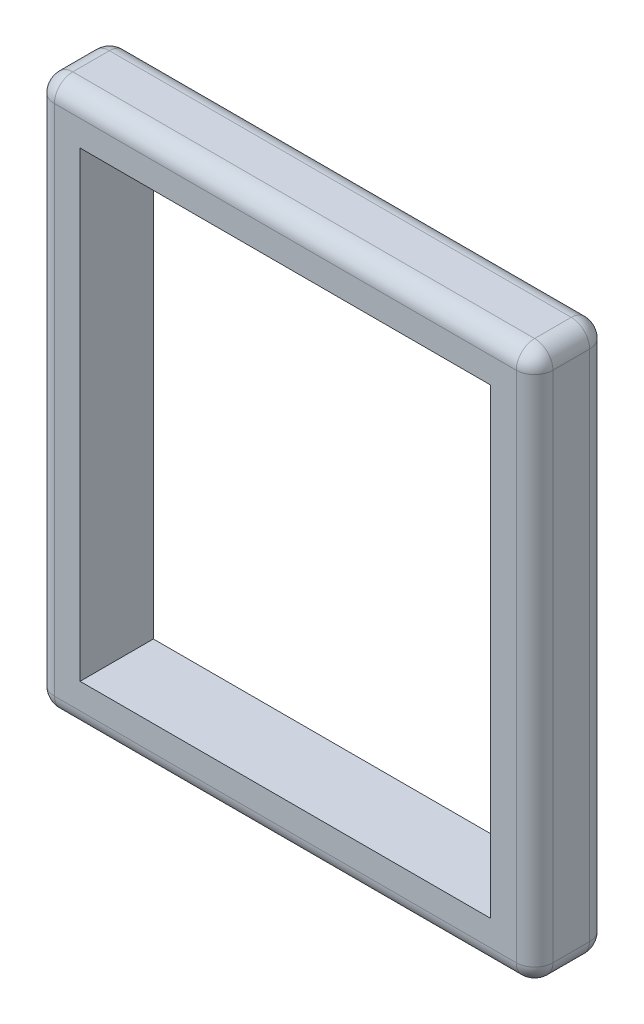
ISO-10303-21;
HEADER;
FILE_DESCRIPTION(('STEP AP214'),'2;1');
FILE_NAME('part.step','',(''),(''),'','','');
FILE_SCHEMA(('AUTOMOTIVE_DESIGN { 1 0 10303 214 1 1 1 1 }'));
ENDSEC;
DATA;
#1=APPLICATION_CONTEXT('core data for automotive mechanical design processes');
#2=APPLICATION_PROTOCOL_DEFINITION('international standard','automotive_design',2000,#1);
#3=PRODUCT_CONTEXT('',#1,'mechanical');
#4=PRODUCT('Part','Part','',(#3));
#5=PRODUCT_RELATED_PRODUCT_CATEGORY('part','',(#4));
#6=PRODUCT_DEFINITION_FORMATION('','',#4);
#7=PRODUCT_DEFINITION_CONTEXT('part definition',#1,'design');
#8=PRODUCT_DEFINITION('design','',#6,#7);
#9=PRODUCT_DEFINITION_SHAPE('','',#8);
#10=(LENGTH_UNIT() NAMED_UNIT(*) SI_UNIT(.MILLI.,.METRE.));
#11=(NAMED_UNIT(*) PLANE_ANGLE_UNIT() SI_UNIT($,.RADIAN.));
#12=(NAMED_UNIT(*) SI_UNIT($,.STERADIAN.) SOLID_ANGLE_UNIT());
#13=UNCERTAINTY_MEASURE_WITH_UNIT(LENGTH_MEASURE(1.E-05),#10,'distance_accuracy_value','');
#14=(GEOMETRIC_REPRESENTATION_CONTEXT(3) GLOBAL_UNCERTAINTY_ASSIGNED_CONTEXT((#13)) GLOBAL_UNIT_ASSIGNED_CONTEXT((#10,
#11,#12)) REPRESENTATION_CONTEXT('',''));
#15=CARTESIAN_POINT('',(0.,0.,0.));
#16=DIRECTION('',(0.,0.,1.));
#17=DIRECTION('',(1.,0.,0.));
#18=AXIS2_PLACEMENT_3D('',#15,#16,#17);
#19=CARTESIAN_POINT('',(0.,0.,12.7));
#20=DIRECTION('',(0.,0.,1.));
#21=DIRECTION('',(1.,0.,0.));
#22=AXIS2_PLACEMENT_3D('',#19,#20,#21);
#23=PLANE('',#22);
#24=DIRECTION('',(-1.,0.,0.));
#25=VECTOR('',#24,1.);
#26=CARTESIAN_POINT('',(-86.36,92.075,12.7));
#27=LINE('',#26,#25);
#28=CARTESIAN_POINT('',(-3.175,92.075,12.7));
#29=VERTEX_POINT('',#28);
#30=CARTESIAN_POINT('',(-83.185,92.075,12.7));
#31=VERTEX_POINT('',#30);
#32=EDGE_CURVE('E212',#29,#31,#27,.T.);
#33=ORIENTED_EDGE('',*,*,#32,.T.);
#34=DIRECTION('',(0.,-1.,0.));
#35=VECTOR('',#34,1.);
#36=CARTESIAN_POINT('',(-83.185,0.,12.7));
#37=LINE('',#36,#35);
#38=CARTESIAN_POINT('',(-83.185,3.17499999999999,12.7));
#39=VERTEX_POINT('',#38);
#40=EDGE_CURVE('E215',#31,#39,#37,.T.);
#41=ORIENTED_EDGE('',*,*,#40,.T.);
#42=DIRECTION('',(1.,0.,0.));
#43=VECTOR('',#42,1.);
#44=CARTESIAN_POINT('',(0.,3.175,12.7));
#45=LINE('',#44,#43);
#46=CARTESIAN_POINT('',(-3.175,3.175,12.7));
#47=VERTEX_POINT('',#46);
#48=EDGE_CURVE('E174',#39,#47,#45,.T.);
#49=ORIENTED_EDGE('',*,*,#48,.T.);
#50=DIRECTION('',(0.,1.,0.));
#51=VECTOR('',#50,1.);
#52=CARTESIAN_POINT('',(-3.175,95.25,12.7));
#53=LINE('',#52,#51);
#54=EDGE_CURVE('E209',#47,#29,#53,.T.);
#55=ORIENTED_EDGE('',*,*,#54,.T.);
#56=EDGE_LOOP('',(#33,#41,#49,#55));
#57=FACE_BOUND('',#56,.T.);
#58=DIRECTION('',(1.,0.,0.));
#59=VECTOR('',#58,1.);
#60=CARTESIAN_POINT('',(-78.74,7.61999999999999,12.7));
#61=LINE('',#60,#59);
#62=CARTESIAN_POINT('',(-78.74,7.61999999999999,12.7));
#63=VERTEX_POINT('',#62);
#64=CARTESIAN_POINT('',(-7.62,7.61999999999999,12.7));
#65=VERTEX_POINT('',#64);
#66=EDGE_CURVE('E165',#63,#65,#61,.T.);
#67=ORIENTED_EDGE('',*,*,#66,.F.);
#68=DIRECTION('',(0.,-1.,0.));
#69=VECTOR('',#68,1.);
#70=CARTESIAN_POINT('',(-78.74,87.63,12.7));
#71=LINE('',#70,#69);
#72=CARTESIAN_POINT('',(-78.74,87.63,12.7));
#73=VERTEX_POINT('',#72);
#74=EDGE_CURVE('E154',#73,#63,#71,.T.);
#75=ORIENTED_EDGE('',*,*,#74,.F.);
#76=DIRECTION('',(-1.,0.,0.));
#77=VECTOR('',#76,1.);
#78=CARTESIAN_POINT('',(-78.74,87.63,12.7));
#79=LINE('',#78,#77);
#80=CARTESIAN_POINT('',(-7.62000000000001,87.63,12.7));
#81=VERTEX_POINT('',#80);
#82=EDGE_CURVE('E183',#81,#73,#79,.T.);
#83=ORIENTED_EDGE('',*,*,#82,.F.);
#84=DIRECTION('',(0.,1.,0.));
#85=VECTOR('',#84,1.);
#86=CARTESIAN_POINT('',(-7.62000000000001,87.63,12.7));
#87=LINE('',#86,#85);
#88=EDGE_CURVE('E179',#65,#81,#87,.T.);
#89=ORIENTED_EDGE('',*,*,#88,.F.);
#90=EDGE_LOOP('',(#67,#75,#83,#89));
#91=FACE_BOUND('',#90,.T.);
#92=ADVANCED_FACE('F39',(#57,#91),#23,.T.);
#93=CARTESIAN_POINT('',(0.,0.,0.));
#94=DIRECTION('',(0.,0.,1.));
#95=DIRECTION('',(1.,0.,0.));
#96=AXIS2_PLACEMENT_3D('',#93,#94,#95);
#97=PLANE('',#96);
#98=DIRECTION('',(1.,0.,0.));
#99=VECTOR('',#98,1.);
#100=CARTESIAN_POINT('',(0.,3.175,0.));
#101=LINE('',#100,#99);
#102=CARTESIAN_POINT('',(-3.175,3.175,0.));
#103=VERTEX_POINT('',#102);
#104=CARTESIAN_POINT('',(-83.185,3.17499999999999,0.));
#105=VERTEX_POINT('',#104);
#106=EDGE_CURVE('E232',#103,#105,#101,.F.);
#107=ORIENTED_EDGE('',*,*,#106,.T.);
#108=DIRECTION('',(0.,-1.,0.));
#109=VECTOR('',#108,1.);
#110=CARTESIAN_POINT('',(-83.185,0.,0.));
#111=LINE('',#110,#109);
#112=CARTESIAN_POINT('',(-83.185,92.075,0.));
#113=VERTEX_POINT('',#112);
#114=EDGE_CURVE('E241',#105,#113,#111,.F.);
#115=ORIENTED_EDGE('',*,*,#114,.T.);
#116=DIRECTION('',(-1.,0.,0.));
#117=VECTOR('',#116,1.);
#118=CARTESIAN_POINT('',(0.,92.075,0.));
#119=LINE('',#118,#117);
#120=CARTESIAN_POINT('',(-3.175,92.075,0.));
#121=VERTEX_POINT('',#120);
#122=EDGE_CURVE('E238',#113,#121,#119,.F.);
#123=ORIENTED_EDGE('',*,*,#122,.T.);
#124=DIRECTION('',(0.,1.,0.));
#125=VECTOR('',#124,1.);
#126=CARTESIAN_POINT('',(-3.175,0.,0.));
#127=LINE('',#126,#125);
#128=EDGE_CURVE('E235',#121,#103,#127,.F.);
#129=ORIENTED_EDGE('',*,*,#128,.T.);
#130=EDGE_LOOP('',(#107,#115,#123,#129));
#131=FACE_BOUND('',#130,.T.);
#132=DIRECTION('',(0.,-1.,0.));
#133=VECTOR('',#132,1.);
#134=CARTESIAN_POINT('',(-78.74,87.63,0.));
#135=LINE('',#134,#133);
#136=CARTESIAN_POINT('',(-78.74,87.63,0.));
#137=VERTEX_POINT('',#136);
#138=CARTESIAN_POINT('',(-78.74,7.61999999999999,0.));
#139=VERTEX_POINT('',#138);
#140=EDGE_CURVE('E188',#137,#139,#135,.T.);
#141=ORIENTED_EDGE('',*,*,#140,.T.);
#142=DIRECTION('',(1.,0.,0.));
#143=VECTOR('',#142,1.);
#144=CARTESIAN_POINT('',(-78.74,7.61999999999999,0.));
#145=LINE('',#144,#143);
#146=CARTESIAN_POINT('',(-7.62,7.61999999999999,0.));
#147=VERTEX_POINT('',#146);
#148=EDGE_CURVE('E172',#139,#147,#145,.T.);
#149=ORIENTED_EDGE('',*,*,#148,.T.);
#150=DIRECTION('',(0.,1.,0.));
#151=VECTOR('',#150,1.);
#152=CARTESIAN_POINT('',(-7.62000000000001,87.63,0.));
#153=LINE('',#152,#151);
#154=CARTESIAN_POINT('',(-7.62000000000001,87.63,0.));
#155=VERTEX_POINT('',#154);
#156=EDGE_CURVE('E193',#147,#155,#153,.T.);
#157=ORIENTED_EDGE('',*,*,#156,.T.);
#158=DIRECTION('',(-1.,0.,0.));
#159=VECTOR('',#158,1.);
#160=CARTESIAN_POINT('',(-78.74,87.63,0.));
#161=LINE('',#160,#159);
#162=EDGE_CURVE('E166',#155,#137,#161,.T.);
#163=ORIENTED_EDGE('',*,*,#162,.T.);
#164=EDGE_LOOP('',(#141,#149,#157,#163));
#165=FACE_BOUND('',#164,.T.);
#166=ADVANCED_FACE('F413',(#131,#165),#97,.F.);
#167=CARTESIAN_POINT('',(0.,0.,12.7));
#168=DIRECTION('',(-1.,0.,0.));
#169=DIRECTION('',(0.,-1.,0.));
#170=AXIS2_PLACEMENT_3D('',#167,#168,#169);
#171=PLANE('',#170);
#172=DIRECTION('',(0.,0.,-1.));
#173=VECTOR('',#172,1.);
#174=CARTESIAN_POINT('',(0.,92.075,12.7));
#175=LINE('',#174,#173);
#176=CARTESIAN_POINT('',(0.,92.075,3.175));
#177=VERTEX_POINT('',#176);
#178=CARTESIAN_POINT('',(0.,92.075,9.525));
#179=VERTEX_POINT('',#178);
#180=EDGE_CURVE('E264',#177,#179,#175,.F.);
#181=ORIENTED_EDGE('',*,*,#180,.T.);
#182=DIRECTION('',(0.,1.,0.));
#183=VECTOR('',#182,1.);
#184=CARTESIAN_POINT('',(0.,0.,9.525));
#185=LINE('',#184,#183);
#186=CARTESIAN_POINT('',(0.,3.175,9.525));
#187=VERTEX_POINT('',#186);
#188=EDGE_CURVE('E267',#179,#187,#185,.F.);
#189=ORIENTED_EDGE('',*,*,#188,.T.);
#190=DIRECTION('',(0.,0.,-1.));
#191=VECTOR('',#190,1.);
#192=CARTESIAN_POINT('',(0.,3.175,12.7));
#193=LINE('',#192,#191);
#194=CARTESIAN_POINT('',(0.,3.175,3.175));
#195=VERTEX_POINT('',#194);
#196=EDGE_CURVE('E258',#187,#195,#193,.T.);
#197=ORIENTED_EDGE('',*,*,#196,.T.);
#198=DIRECTION('',(0.,1.,0.));
#199=VECTOR('',#198,1.);
#200=CARTESIAN_POINT('',(0.,0.,3.175));
#201=LINE('',#200,#199);
#202=EDGE_CURVE('E261',#195,#177,#201,.T.);
#203=ORIENTED_EDGE('',*,*,#202,.T.);
#204=EDGE_LOOP('',(#181,#189,#197,#203));
#205=FACE_BOUND('',#204,.T.);
#206=ADVANCED_FACE('F393',(#205),#171,.F.);
#207=CARTESIAN_POINT('',(0.,95.25,12.7));
#208=DIRECTION('',(0.,-1.,0.));
#209=DIRECTION('',(0.,0.,-1.));
#210=AXIS2_PLACEMENT_3D('',#207,#208,#209);
#211=PLANE('',#210);
#212=DIRECTION('',(0.,0.,-1.));
#213=VECTOR('',#212,1.);
#214=CARTESIAN_POINT('',(-83.185,95.25,12.7));
#215=LINE('',#214,#213);
#216=CARTESIAN_POINT('',(-83.185,95.25,3.175));
#217=VERTEX_POINT('',#216);
#218=CARTESIAN_POINT('',(-83.185,95.25,9.525));
#219=VERTEX_POINT('',#218);
#220=EDGE_CURVE('E251',#217,#219,#215,.F.);
#221=ORIENTED_EDGE('',*,*,#220,.T.);
#222=DIRECTION('',(-1.,0.,0.));
#223=VECTOR('',#222,1.);
#224=CARTESIAN_POINT('',(0.,95.25,9.525));
#225=LINE('',#224,#223);
#226=CARTESIAN_POINT('',(-3.175,95.25,9.525));
#227=VERTEX_POINT('',#226);
#228=EDGE_CURVE('E254',#219,#227,#225,.F.);
#229=ORIENTED_EDGE('',*,*,#228,.T.);
#230=DIRECTION('',(0.,0.,-1.));
#231=VECTOR('',#230,1.);
#232=CARTESIAN_POINT('',(-3.175,95.25,12.7));
#233=LINE('',#232,#231);
#234=CARTESIAN_POINT('',(-3.175,95.25,3.175));
#235=VERTEX_POINT('',#234);
#236=EDGE_CURVE('E245',#227,#235,#233,.T.);
#237=ORIENTED_EDGE('',*,*,#236,.T.);
#238=DIRECTION('',(-1.,0.,0.));
#239=VECTOR('',#238,1.);
#240=CARTESIAN_POINT('',(0.,95.25,3.175));
#241=LINE('',#240,#239);
#242=EDGE_CURVE('E248',#235,#217,#241,.T.);
#243=ORIENTED_EDGE('',*,*,#242,.T.);
#244=EDGE_LOOP('',(#221,#229,#237,#243));
#245=FACE_BOUND('',#244,.T.);
#246=ADVANCED_FACE('F384',(#245),#211,.F.);
#247=CARTESIAN_POINT('',(-86.36,0.,12.7));
#248=DIRECTION('',(1.,0.,0.));
#249=DIRECTION('',(0.,0.,-1.));
#250=AXIS2_PLACEMENT_3D('',#247,#248,#249);
#251=PLANE('',#250);
#252=DIRECTION('',(0.,-1.,0.));
#253=VECTOR('',#252,1.);
#254=CARTESIAN_POINT('',(-86.36,95.25,9.525));
#255=LINE('',#254,#253);
#256=CARTESIAN_POINT('',(-86.36,3.17499999999999,9.525));
#257=VERTEX_POINT('',#256);
#258=CARTESIAN_POINT('',(-86.36,92.075,9.525));
#259=VERTEX_POINT('',#258);
#260=EDGE_CURVE('E225',#257,#259,#255,.F.);
#261=ORIENTED_EDGE('',*,*,#260,.T.);
#262=DIRECTION('',(0.,0.,-1.));
#263=VECTOR('',#262,1.);
#264=CARTESIAN_POINT('',(-86.36,92.075,12.7));
#265=LINE('',#264,#263);
#266=CARTESIAN_POINT('',(-86.36,92.075,3.175));
#267=VERTEX_POINT('',#266);
#268=EDGE_CURVE('E229',#259,#267,#265,.T.);
#269=ORIENTED_EDGE('',*,*,#268,.T.);
#270=DIRECTION('',(0.,-1.,0.));
#271=VECTOR('',#270,1.);
#272=CARTESIAN_POINT('',(-86.36,0.,3.175));
#273=LINE('',#272,#271);
#274=CARTESIAN_POINT('',(-86.36,3.17499999999999,3.175));
#275=VERTEX_POINT('',#274);
#276=EDGE_CURVE('E222',#267,#275,#273,.T.);
#277=ORIENTED_EDGE('',*,*,#276,.T.);
#278=DIRECTION('',(0.,0.,-1.));
#279=VECTOR('',#278,1.);
#280=CARTESIAN_POINT('',(-86.36,3.17499999999999,12.7));
#281=LINE('',#280,#279);
#282=EDGE_CURVE('E219',#275,#257,#281,.F.);
#283=ORIENTED_EDGE('',*,*,#282,.T.);
#284=EDGE_LOOP('',(#261,#269,#277,#283));
#285=FACE_BOUND('',#284,.T.);
#286=ADVANCED_FACE('F460',(#285),#251,.F.);
#287=CARTESIAN_POINT('',(0.,0.,12.7));
#288=DIRECTION('',(0.,1.,0.));
#289=DIRECTION('',(-1.,0.,0.));
#290=AXIS2_PLACEMENT_3D('',#287,#288,#289);
#291=PLANE('',#290);
#292=DIRECTION('',(1.,0.,0.));
#293=VECTOR('',#292,1.);
#294=CARTESIAN_POINT('',(-86.36,0.,9.525));
#295=LINE('',#294,#293);
#296=CARTESIAN_POINT('',(-3.175,0.,9.525));
#297=VERTEX_POINT('',#296);
#298=CARTESIAN_POINT('',(-83.185,0.,9.525));
#299=VERTEX_POINT('',#298);
#300=EDGE_CURVE('E49',#297,#299,#295,.F.);
#301=ORIENTED_EDGE('',*,*,#300,.T.);
#302=DIRECTION('',(0.,0.,-1.));
#303=VECTOR('',#302,1.);
#304=CARTESIAN_POINT('',(-83.185,0.,12.7));
#305=LINE('',#304,#303);
#306=CARTESIAN_POINT('',(-83.185,0.,3.175));
#307=VERTEX_POINT('',#306);
#308=EDGE_CURVE('E11',#299,#307,#305,.T.);
#309=ORIENTED_EDGE('',*,*,#308,.T.);
#310=DIRECTION('',(1.,0.,0.));
#311=VECTOR('',#310,1.);
#312=CARTESIAN_POINT('',(0.,0.,3.175));
#313=LINE('',#312,#311);
#314=CARTESIAN_POINT('',(-3.175,0.,3.175));
#315=VERTEX_POINT('',#314);
#316=EDGE_CURVE('E271',#307,#315,#313,.T.);
#317=ORIENTED_EDGE('',*,*,#316,.T.);
#318=DIRECTION('',(0.,0.,-1.));
#319=VECTOR('',#318,1.);
#320=CARTESIAN_POINT('',(-3.175,0.,12.7));
#321=LINE('',#320,#319);
#322=EDGE_CURVE('E60',#315,#297,#321,.F.);
#323=ORIENTED_EDGE('',*,*,#322,.T.);
#324=EDGE_LOOP('',(#301,#309,#317,#323));
#325=FACE_BOUND('',#324,.T.);
#326=ADVANCED_FACE('F457',(#325),#291,.F.);
#327=CARTESIAN_POINT('',(-78.74,87.63,12.7));
#328=DIRECTION('',(1.,0.,0.));
#329=DIRECTION('',(0.,0.,-1.));
#330=AXIS2_PLACEMENT_3D('',#327,#328,#329);
#331=PLANE('',#330);
#332=ORIENTED_EDGE('',*,*,#140,.F.);
#333=DIRECTION('',(0.,0.,-1.));
#334=VECTOR('',#333,1.);
#335=CARTESIAN_POINT('',(-78.74,87.63,12.7));
#336=LINE('',#335,#334);
#337=EDGE_CURVE('E160',#73,#137,#336,.T.);
#338=ORIENTED_EDGE('',*,*,#337,.F.);
#339=ORIENTED_EDGE('',*,*,#74,.T.);
#340=DIRECTION('',(0.,0.,-1.));
#341=VECTOR('',#340,1.);
#342=CARTESIAN_POINT('',(-78.74,7.61999999999999,12.7));
#343=LINE('',#342,#341);
#344=EDGE_CURVE('E157',#63,#139,#343,.T.);
#345=ORIENTED_EDGE('',*,*,#344,.T.);
#346=EDGE_LOOP('',(#332,#338,#339,#345));
#347=FACE_BOUND('',#346,.T.);
#348=ADVANCED_FACE('F156',(#347),#331,.T.);
#349=CARTESIAN_POINT('',(-78.74,7.61999999999999,12.7));
#350=DIRECTION('',(0.,1.,0.));
#351=DIRECTION('',(0.,0.,1.));
#352=AXIS2_PLACEMENT_3D('',#349,#350,#351);
#353=PLANE('',#352);
#354=ORIENTED_EDGE('',*,*,#148,.F.);
#355=ORIENTED_EDGE('',*,*,#344,.F.);
#356=ORIENTED_EDGE('',*,*,#66,.T.);
#357=DIRECTION('',(0.,0.,-1.));
#358=VECTOR('',#357,1.);
#359=CARTESIAN_POINT('',(-7.62,7.61999999999999,12.7));
#360=LINE('',#359,#358);
#361=EDGE_CURVE('E175',#65,#147,#360,.T.);
#362=ORIENTED_EDGE('',*,*,#361,.T.);
#363=EDGE_LOOP('',(#354,#355,#356,#362));
#364=FACE_BOUND('',#363,.T.);
#365=ADVANCED_FACE('F169',(#364),#353,.T.);
#366=CARTESIAN_POINT('',(-7.62000000000001,87.63,12.7));
#367=DIRECTION('',(-1.,0.,0.));
#368=DIRECTION('',(0.,-1.,0.));
#369=AXIS2_PLACEMENT_3D('',#366,#367,#368);
#370=PLANE('',#369);
#371=ORIENTED_EDGE('',*,*,#156,.F.);
#372=ORIENTED_EDGE('',*,*,#361,.F.);
#373=ORIENTED_EDGE('',*,*,#88,.T.);
#374=DIRECTION('',(0.,0.,-1.));
#375=VECTOR('',#374,1.);
#376=CARTESIAN_POINT('',(-7.62000000000001,87.63,12.7));
#377=LINE('',#376,#375);
#378=EDGE_CURVE('E202',#81,#155,#377,.T.);
#379=ORIENTED_EDGE('',*,*,#378,.T.);
#380=EDGE_LOOP('',(#371,#372,#373,#379));
#381=FACE_BOUND('',#380,.T.);
#382=ADVANCED_FACE('F630',(#381),#370,.T.);
#383=CARTESIAN_POINT('',(-78.74,87.63,12.7));
#384=DIRECTION('',(0.,-1.,0.));
#385=DIRECTION('',(0.,0.,-1.));
#386=AXIS2_PLACEMENT_3D('',#383,#384,#385);
#387=PLANE('',#386);
#388=ORIENTED_EDGE('',*,*,#162,.F.);
#389=ORIENTED_EDGE('',*,*,#378,.F.);
#390=ORIENTED_EDGE('',*,*,#82,.T.);
#391=ORIENTED_EDGE('',*,*,#337,.T.);
#392=EDGE_LOOP('',(#388,#389,#390,#391));
#393=FACE_BOUND('',#392,.T.);
#394=ADVANCED_FACE('F622',(#393),#387,.T.);
#395=CARTESIAN_POINT('',(-3.175,0.,3.175));
#396=DIRECTION('',(0.,1.,0.));
#397=DIRECTION('',(-1.,0.,0.));
#398=AXIS2_PLACEMENT_3D('',#395,#396,#397);
#399=CYLINDRICAL_SURFACE('',#398,3.175);
#400=CARTESIAN_POINT('',(-3.175,92.075,3.175));
#401=DIRECTION('',(0.,1.,0.));
#402=DIRECTION('',(0.,0.,1.));
#403=AXIS2_PLACEMENT_3D('',#400,#401,#402);
#404=CIRCLE('',#403,3.175);
#405=EDGE_CURVE('E43',#177,#121,#404,.T.);
#406=ORIENTED_EDGE('',*,*,#405,.F.);
#407=ORIENTED_EDGE('',*,*,#202,.F.);
#408=CARTESIAN_POINT('',(-3.175,3.175,3.175));
#409=DIRECTION('',(0.,-1.,0.));
#410=DIRECTION('',(0.,0.,-1.));
#411=AXIS2_PLACEMENT_3D('',#408,#409,#410);
#412=CIRCLE('',#411,3.175);
#413=EDGE_CURVE('E359',#103,#195,#412,.T.);
#414=ORIENTED_EDGE('',*,*,#413,.F.);
#415=ORIENTED_EDGE('',*,*,#128,.F.);
#416=EDGE_LOOP('',(#406,#407,#414,#415));
#417=FACE_BOUND('',#416,.T.);
#418=ADVANCED_FACE('F41',(#417),#399,.T.);
#419=CARTESIAN_POINT('',(-3.175,92.075,3.175));
#420=DIRECTION('',(0.,0.,1.));
#421=DIRECTION('',(1.,0.,0.));
#422=AXIS2_PLACEMENT_3D('',#419,#420,#421);
#423=SPHERICAL_SURFACE('',#422,3.175);
#424=CARTESIAN_POINT('',(-3.175,92.075,3.175));
#425=DIRECTION('',(0.,0.,-1.));
#426=DIRECTION('',(-1.,0.,0.));
#427=AXIS2_PLACEMENT_3D('',#424,#425,#426);
#428=CIRCLE('',#427,3.175);
#429=EDGE_CURVE('E352',#177,#235,#428,.F.);
#430=ORIENTED_EDGE('',*,*,#429,.F.);
#431=ORIENTED_EDGE('',*,*,#405,.T.);
#432=CARTESIAN_POINT('',(-3.175,92.075,3.175));
#433=DIRECTION('',(1.,0.,0.));
#434=DIRECTION('',(0.,0.,-1.));
#435=AXIS2_PLACEMENT_3D('',#432,#433,#434);
#436=CIRCLE('',#435,3.175);
#437=EDGE_CURVE('E356',#235,#121,#436,.F.);
#438=ORIENTED_EDGE('',*,*,#437,.F.);
#439=EDGE_LOOP('',(#430,#431,#438));
#440=FACE_BOUND('',#439,.T.);
#441=ADVANCED_FACE('F372',(#440),#423,.T.);
#442=CARTESIAN_POINT('',(-3.175,3.175,3.175));
#443=DIRECTION('',(0.,0.,1.));
#444=DIRECTION('',(1.,0.,0.));
#445=AXIS2_PLACEMENT_3D('',#442,#443,#444);
#446=SPHERICAL_SURFACE('',#445,3.175);
#447=CARTESIAN_POINT('',(-3.175,3.175,3.175));
#448=DIRECTION('',(1.,0.,0.));
#449=DIRECTION('',(0.,1.,0.));
#450=AXIS2_PLACEMENT_3D('',#447,#448,#449);
#451=CIRCLE('',#450,3.175);
#452=EDGE_CURVE('E344',#103,#315,#451,.F.);
#453=ORIENTED_EDGE('',*,*,#452,.F.);
#454=ORIENTED_EDGE('',*,*,#413,.T.);
#455=CARTESIAN_POINT('',(-3.175,3.175,3.175));
#456=DIRECTION('',(0.,0.,-1.));
#457=DIRECTION('',(-1.,0.,0.));
#458=AXIS2_PLACEMENT_3D('',#455,#456,#457);
#459=CIRCLE('',#458,3.175);
#460=EDGE_CURVE('E348',#315,#195,#459,.F.);
#461=ORIENTED_EDGE('',*,*,#460,.F.);
#462=EDGE_LOOP('',(#453,#454,#461));
#463=FACE_BOUND('',#462,.T.);
#464=ADVANCED_FACE('F406',(#463),#446,.T.);
#465=CARTESIAN_POINT('',(0.,92.075,3.175));
#466=DIRECTION('',(-1.,0.,0.));
#467=DIRECTION('',(0.,0.,1.));
#468=AXIS2_PLACEMENT_3D('',#465,#466,#467);
#469=CYLINDRICAL_SURFACE('',#468,3.175);
#470=ORIENTED_EDGE('',*,*,#437,.T.);
#471=ORIENTED_EDGE('',*,*,#122,.F.);
#472=CARTESIAN_POINT('',(-83.185,92.075,3.175));
#473=DIRECTION('',(-1.,0.,0.));
#474=DIRECTION('',(0.,0.,1.));
#475=AXIS2_PLACEMENT_3D('',#472,#473,#474);
#476=CIRCLE('',#475,3.175);
#477=EDGE_CURVE('E337',#217,#113,#476,.T.);
#478=ORIENTED_EDGE('',*,*,#477,.F.);
#479=ORIENTED_EDGE('',*,*,#242,.F.);
#480=EDGE_LOOP('',(#470,#471,#478,#479));
#481=FACE_BOUND('',#480,.T.);
#482=ADVANCED_FACE('F380',(#481),#469,.T.);
#483=CARTESIAN_POINT('',(-3.175,92.075,12.7));
#484=DIRECTION('',(0.,0.,-1.));
#485=DIRECTION('',(-1.,0.,0.));
#486=AXIS2_PLACEMENT_3D('',#483,#484,#485);
#487=CYLINDRICAL_SURFACE('',#486,3.175);
#488=ORIENTED_EDGE('',*,*,#429,.T.);
#489=ORIENTED_EDGE('',*,*,#236,.F.);
#490=CARTESIAN_POINT('',(-3.175,92.075,9.525));
#491=DIRECTION('',(0.,0.,1.));
#492=DIRECTION('',(1.,0.,0.));
#493=AXIS2_PLACEMENT_3D('',#490,#491,#492);
#494=CIRCLE('',#493,3.175);
#495=EDGE_CURVE('E333',#179,#227,#494,.T.);
#496=ORIENTED_EDGE('',*,*,#495,.F.);
#497=ORIENTED_EDGE('',*,*,#180,.F.);
#498=EDGE_LOOP('',(#488,#489,#496,#497));
#499=FACE_BOUND('',#498,.T.);
#500=ADVANCED_FACE('F390',(#499),#487,.T.);
#501=CARTESIAN_POINT('',(-3.175,0.,9.525));
#502=DIRECTION('',(0.,-1.,0.));
#503=DIRECTION('',(1.,0.,0.));
#504=AXIS2_PLACEMENT_3D('',#501,#502,#503);
#505=CYLINDRICAL_SURFACE('',#504,3.175);
#506=CARTESIAN_POINT('',(-3.175,3.175,9.525));
#507=DIRECTION('',(0.,-1.,0.));
#508=DIRECTION('',(0.,0.,-1.));
#509=AXIS2_PLACEMENT_3D('',#506,#507,#508);
#510=CIRCLE('',#509,3.175);
#511=EDGE_CURVE('E325',#187,#47,#510,.T.);
#512=ORIENTED_EDGE('',*,*,#511,.F.);
#513=ORIENTED_EDGE('',*,*,#188,.F.);
#514=CARTESIAN_POINT('',(-3.175,92.075,9.525));
#515=DIRECTION('',(0.,1.,0.));
#516=DIRECTION('',(0.,0.,1.));
#517=AXIS2_PLACEMENT_3D('',#514,#515,#516);
#518=CIRCLE('',#517,3.175);
#519=EDGE_CURVE('E329',#29,#179,#518,.T.);
#520=ORIENTED_EDGE('',*,*,#519,.F.);
#521=ORIENTED_EDGE('',*,*,#54,.F.);
#522=EDGE_LOOP('',(#512,#513,#520,#521));
#523=FACE_BOUND('',#522,.T.);
#524=ADVANCED_FACE('F397',(#523),#505,.T.);
#525=CARTESIAN_POINT('',(-3.175,3.175,12.7));
#526=DIRECTION('',(0.,0.,-1.));
#527=DIRECTION('',(-1.,0.,0.));
#528=AXIS2_PLACEMENT_3D('',#525,#526,#527);
#529=CYLINDRICAL_SURFACE('',#528,3.175);
#530=ORIENTED_EDGE('',*,*,#460,.T.);
#531=ORIENTED_EDGE('',*,*,#196,.F.);
#532=CARTESIAN_POINT('',(-3.175,3.175,9.525));
#533=DIRECTION('',(0.,0.,1.));
#534=DIRECTION('',(1.,0.,0.));
#535=AXIS2_PLACEMENT_3D('',#532,#533,#534);
#536=CIRCLE('',#535,3.175);
#537=EDGE_CURVE('E322',#297,#187,#536,.T.);
#538=ORIENTED_EDGE('',*,*,#537,.F.);
#539=ORIENTED_EDGE('',*,*,#322,.F.);
#540=EDGE_LOOP('',(#530,#531,#538,#539));
#541=FACE_BOUND('',#540,.T.);
#542=ADVANCED_FACE('F404',(#541),#529,.T.);
#543=CARTESIAN_POINT('',(0.,3.175,3.175));
#544=DIRECTION('',(1.,0.,0.));
#545=DIRECTION('',(0.,1.,0.));
#546=AXIS2_PLACEMENT_3D('',#543,#544,#545);
#547=CYLINDRICAL_SURFACE('',#546,3.175);
#548=ORIENTED_EDGE('',*,*,#452,.T.);
#549=ORIENTED_EDGE('',*,*,#316,.F.);
#550=CARTESIAN_POINT('',(-83.185,3.17499999999999,3.175));
#551=DIRECTION('',(-1.,0.,0.));
#552=DIRECTION('',(0.,0.,1.));
#553=AXIS2_PLACEMENT_3D('',#550,#551,#552);
#554=CIRCLE('',#553,3.175);
#555=EDGE_CURVE('E318',#105,#307,#554,.T.);
#556=ORIENTED_EDGE('',*,*,#555,.F.);
#557=ORIENTED_EDGE('',*,*,#106,.F.);
#558=EDGE_LOOP('',(#548,#549,#556,#557));
#559=FACE_BOUND('',#558,.T.);
#560=ADVANCED_FACE('F410',(#559),#547,.T.);
#561=CARTESIAN_POINT('',(-83.185,0.,3.175));
#562=DIRECTION('',(0.,-1.,0.));
#563=DIRECTION('',(0.,0.,-1.));
#564=AXIS2_PLACEMENT_3D('',#561,#562,#563);
#565=CYLINDRICAL_SURFACE('',#564,3.175);
#566=CARTESIAN_POINT('',(-83.185,92.075,3.175));
#567=DIRECTION('',(0.,1.,0.));
#568=DIRECTION('',(0.,0.,1.));
#569=AXIS2_PLACEMENT_3D('',#566,#567,#568);
#570=CIRCLE('',#569,3.175);
#571=EDGE_CURVE('E340',#113,#267,#570,.T.);
#572=ORIENTED_EDGE('',*,*,#571,.F.);
#573=ORIENTED_EDGE('',*,*,#114,.F.);
#574=CARTESIAN_POINT('',(-83.185,3.17499999999999,3.175));
#575=DIRECTION('',(0.,-1.,0.));
#576=DIRECTION('',(0.,0.,-1.));
#577=AXIS2_PLACEMENT_3D('',#574,#575,#576);
#578=CIRCLE('',#577,3.175);
#579=EDGE_CURVE('E314',#275,#105,#578,.T.);
#580=ORIENTED_EDGE('',*,*,#579,.F.);
#581=ORIENTED_EDGE('',*,*,#276,.F.);
#582=EDGE_LOOP('',(#572,#573,#580,#581));
#583=FACE_BOUND('',#582,.T.);
#584=ADVANCED_FACE('F418',(#583),#565,.T.);
#585=CARTESIAN_POINT('',(-83.185,92.075,3.175));
#586=DIRECTION('',(0.,0.,1.));
#587=DIRECTION('',(1.,0.,0.));
#588=AXIS2_PLACEMENT_3D('',#585,#586,#587);
#589=SPHERICAL_SURFACE('',#588,3.175);
#590=ORIENTED_EDGE('',*,*,#477,.T.);
#591=ORIENTED_EDGE('',*,*,#571,.T.);
#592=CARTESIAN_POINT('',(-83.185,92.075,3.175));
#593=DIRECTION('',(0.,0.,-1.));
#594=DIRECTION('',(-1.,0.,0.));
#595=AXIS2_PLACEMENT_3D('',#592,#593,#594);
#596=CIRCLE('',#595,3.175);
#597=EDGE_CURVE('E310',#217,#267,#596,.F.);
#598=ORIENTED_EDGE('',*,*,#597,.F.);
#599=EDGE_LOOP('',(#590,#591,#598));
#600=FACE_BOUND('',#599,.T.);
#601=ADVANCED_FACE('F422',(#600),#589,.T.);
#602=CARTESIAN_POINT('',(-3.175,92.075,9.525));
#603=DIRECTION('',(0.,0.,1.));
#604=DIRECTION('',(1.,0.,0.));
#605=AXIS2_PLACEMENT_3D('',#602,#603,#604);
#606=SPHERICAL_SURFACE('',#605,3.175);
#607=ORIENTED_EDGE('',*,*,#519,.T.);
#608=ORIENTED_EDGE('',*,*,#495,.T.);
#609=CARTESIAN_POINT('',(-3.175,92.075,9.525));
#610=DIRECTION('',(1.,0.,0.));
#611=DIRECTION('',(0.,0.,-1.));
#612=AXIS2_PLACEMENT_3D('',#609,#610,#611);
#613=CIRCLE('',#612,3.175);
#614=EDGE_CURVE('E307',#29,#227,#613,.F.);
#615=ORIENTED_EDGE('',*,*,#614,.F.);
#616=EDGE_LOOP('',(#607,#608,#615));
#617=FACE_BOUND('',#616,.T.);
#618=ADVANCED_FACE('F436',(#617),#606,.T.);
#619=CARTESIAN_POINT('',(-3.175,3.175,9.525));
#620=DIRECTION('',(0.,0.,1.));
#621=DIRECTION('',(1.,0.,0.));
#622=AXIS2_PLACEMENT_3D('',#619,#620,#621);
#623=SPHERICAL_SURFACE('',#622,3.175);
#624=ORIENTED_EDGE('',*,*,#537,.T.);
#625=ORIENTED_EDGE('',*,*,#511,.T.);
#626=CARTESIAN_POINT('',(-3.175,3.175,9.525));
#627=DIRECTION('',(1.,0.,0.));
#628=DIRECTION('',(0.,1.,0.));
#629=AXIS2_PLACEMENT_3D('',#626,#627,#628);
#630=CIRCLE('',#629,3.175);
#631=EDGE_CURVE('E303',#297,#47,#630,.F.);
#632=ORIENTED_EDGE('',*,*,#631,.F.);
#633=EDGE_LOOP('',(#624,#625,#632));
#634=FACE_BOUND('',#633,.T.);
#635=ADVANCED_FACE('F438',(#634),#623,.T.);
#636=CARTESIAN_POINT('',(-83.185,3.17499999999999,3.175));
#637=DIRECTION('',(0.,0.,1.));
#638=DIRECTION('',(1.,0.,0.));
#639=AXIS2_PLACEMENT_3D('',#636,#637,#638);
#640=SPHERICAL_SURFACE('',#639,3.175);
#641=ORIENTED_EDGE('',*,*,#579,.T.);
#642=ORIENTED_EDGE('',*,*,#555,.T.);
#643=CARTESIAN_POINT('',(-83.185,3.17499999999999,3.175));
#644=DIRECTION('',(0.,0.,-1.));
#645=DIRECTION('',(-1.,0.,0.));
#646=AXIS2_PLACEMENT_3D('',#643,#644,#645);
#647=CIRCLE('',#646,3.175);
#648=EDGE_CURVE('E300',#275,#307,#647,.F.);
#649=ORIENTED_EDGE('',*,*,#648,.F.);
#650=EDGE_LOOP('',(#641,#642,#649));
#651=FACE_BOUND('',#650,.T.);
#652=ADVANCED_FACE('F444',(#651),#640,.T.);
#653=CARTESIAN_POINT('',(-83.185,92.075,12.7));
#654=DIRECTION('',(0.,0.,-1.));
#655=DIRECTION('',(-1.,0.,0.));
#656=AXIS2_PLACEMENT_3D('',#653,#654,#655);
#657=CYLINDRICAL_SURFACE('',#656,3.175);
#658=ORIENTED_EDGE('',*,*,#597,.T.);
#659=ORIENTED_EDGE('',*,*,#268,.F.);
#660=CARTESIAN_POINT('',(-83.185,92.075,9.525));
#661=DIRECTION('',(0.,0.,1.));
#662=DIRECTION('',(1.,0.,0.));
#663=AXIS2_PLACEMENT_3D('',#660,#661,#662);
#664=CIRCLE('',#663,3.175);
#665=EDGE_CURVE('E296',#219,#259,#664,.T.);
#666=ORIENTED_EDGE('',*,*,#665,.F.);
#667=ORIENTED_EDGE('',*,*,#220,.F.);
#668=EDGE_LOOP('',(#658,#659,#666,#667));
#669=FACE_BOUND('',#668,.T.);
#670=ADVANCED_FACE('F425',(#669),#657,.T.);
#671=CARTESIAN_POINT('',(0.,92.075,9.525));
#672=DIRECTION('',(1.,0.,0.));
#673=DIRECTION('',(0.,0.,-1.));
#674=AXIS2_PLACEMENT_3D('',#671,#672,#673);
#675=CYLINDRICAL_SURFACE('',#674,3.175);
#676=ORIENTED_EDGE('',*,*,#614,.T.);
#677=ORIENTED_EDGE('',*,*,#228,.F.);
#678=CARTESIAN_POINT('',(-83.185,92.075,9.525));
#679=DIRECTION('',(-1.,0.,0.));
#680=DIRECTION('',(0.,0.,1.));
#681=AXIS2_PLACEMENT_3D('',#678,#679,#680);
#682=CIRCLE('',#681,3.175);
#683=EDGE_CURVE('E292',#31,#219,#682,.T.);
#684=ORIENTED_EDGE('',*,*,#683,.F.);
#685=ORIENTED_EDGE('',*,*,#32,.F.);
#686=EDGE_LOOP('',(#676,#677,#684,#685));
#687=FACE_BOUND('',#686,.T.);
#688=ADVANCED_FACE('F434',(#687),#675,.T.);
#689=CARTESIAN_POINT('',(0.,3.175,9.525));
#690=DIRECTION('',(-1.,0.,0.));
#691=DIRECTION('',(0.,-1.,0.));
#692=AXIS2_PLACEMENT_3D('',#689,#690,#691);
#693=CYLINDRICAL_SURFACE('',#692,3.175);
#694=ORIENTED_EDGE('',*,*,#631,.T.);
#695=ORIENTED_EDGE('',*,*,#48,.F.);
#696=CARTESIAN_POINT('',(-83.185,3.17499999999999,9.525));
#697=DIRECTION('',(-1.,0.,0.));
#698=DIRECTION('',(0.,0.,1.));
#699=AXIS2_PLACEMENT_3D('',#696,#697,#698);
#700=CIRCLE('',#699,3.175);
#701=EDGE_CURVE('E288',#299,#39,#700,.T.);
#702=ORIENTED_EDGE('',*,*,#701,.F.);
#703=ORIENTED_EDGE('',*,*,#300,.F.);
#704=EDGE_LOOP('',(#694,#695,#702,#703));
#705=FACE_BOUND('',#704,.T.);
#706=ADVANCED_FACE('F481',(#705),#693,.T.);
#707=CARTESIAN_POINT('',(-83.185,3.17499999999999,12.7));
#708=DIRECTION('',(0.,0.,-1.));
#709=DIRECTION('',(-1.,0.,0.));
#710=AXIS2_PLACEMENT_3D('',#707,#708,#709);
#711=CYLINDRICAL_SURFACE('',#710,3.175);
#712=ORIENTED_EDGE('',*,*,#648,.T.);
#713=ORIENTED_EDGE('',*,*,#308,.F.);
#714=CARTESIAN_POINT('',(-83.185,3.17499999999999,9.525));
#715=DIRECTION('',(0.,0.,1.));
#716=DIRECTION('',(1.,0.,0.));
#717=AXIS2_PLACEMENT_3D('',#714,#715,#716);
#718=CIRCLE('',#717,3.175);
#719=EDGE_CURVE('E284',#257,#299,#718,.T.);
#720=ORIENTED_EDGE('',*,*,#719,.F.);
#721=ORIENTED_EDGE('',*,*,#282,.F.);
#722=EDGE_LOOP('',(#712,#713,#720,#721));
#723=FACE_BOUND('',#722,.T.);
#724=ADVANCED_FACE('F478',(#723),#711,.T.);
#725=CARTESIAN_POINT('',(-83.185,92.075,9.525));
#726=DIRECTION('',(0.,0.,1.));
#727=DIRECTION('',(1.,0.,0.));
#728=AXIS2_PLACEMENT_3D('',#725,#726,#727);
#729=SPHERICAL_SURFACE('',#728,3.175);
#730=ORIENTED_EDGE('',*,*,#683,.T.);
#731=ORIENTED_EDGE('',*,*,#665,.T.);
#732=CARTESIAN_POINT('',(-83.185,92.075,9.525));
#733=DIRECTION('',(0.,1.,0.));
#734=DIRECTION('',(0.,0.,1.));
#735=AXIS2_PLACEMENT_3D('',#732,#733,#734);
#736=CIRCLE('',#735,3.175);
#737=EDGE_CURVE('E281',#31,#259,#736,.F.);
#738=ORIENTED_EDGE('',*,*,#737,.F.);
#739=EDGE_LOOP('',(#730,#731,#738));
#740=FACE_BOUND('',#739,.T.);
#741=ADVANCED_FACE('F430',(#740),#729,.T.);
#742=CARTESIAN_POINT('',(-83.185,3.17499999999999,9.525));
#743=DIRECTION('',(0.,0.,1.));
#744=DIRECTION('',(1.,0.,0.));
#745=AXIS2_PLACEMENT_3D('',#742,#743,#744);
#746=SPHERICAL_SURFACE('',#745,3.175);
#747=ORIENTED_EDGE('',*,*,#719,.T.);
#748=ORIENTED_EDGE('',*,*,#701,.T.);
#749=CARTESIAN_POINT('',(-83.185,3.17499999999999,9.525));
#750=DIRECTION('',(0.,-1.,0.));
#751=DIRECTION('',(0.,0.,-1.));
#752=AXIS2_PLACEMENT_3D('',#749,#750,#751);
#753=CIRCLE('',#752,3.175);
#754=EDGE_CURVE('E278',#257,#39,#753,.F.);
#755=ORIENTED_EDGE('',*,*,#754,.F.);
#756=EDGE_LOOP('',(#747,#748,#755));
#757=FACE_BOUND('',#756,.T.);
#758=ADVANCED_FACE('F471',(#757),#746,.T.);
#759=CARTESIAN_POINT('',(-83.185,0.,9.525));
#760=DIRECTION('',(0.,1.,0.));
#761=DIRECTION('',(0.,0.,1.));
#762=AXIS2_PLACEMENT_3D('',#759,#760,#761);
#763=CYLINDRICAL_SURFACE('',#762,3.175);
#764=ORIENTED_EDGE('',*,*,#737,.T.);
#765=ORIENTED_EDGE('',*,*,#260,.F.);
#766=ORIENTED_EDGE('',*,*,#754,.T.);
#767=ORIENTED_EDGE('',*,*,#40,.F.);
#768=EDGE_LOOP('',(#764,#765,#766,#767));
#769=FACE_BOUND('',#768,.T.);
#770=ADVANCED_FACE('F468',(#769),#763,.T.);
#771=CLOSED_SHELL('',(#92,#166,#206,#246,#286,#326,#348,#365,#382,#394,#418,#441,#464,#482,#500,
#524,#542,#560,#584,#601,#618,#635,#652,#670,#688,#706,#724,#741,#758,#770));
#772=MANIFOLD_SOLID_BREP('B2',#771);
#773=ADVANCED_BREP_SHAPE_REPRESENTATION('',(#18,#772),#14);
#774=SHAPE_DEFINITION_REPRESENTATION(#9,#773);
ENDSEC;
END-ISO-10303-21;
